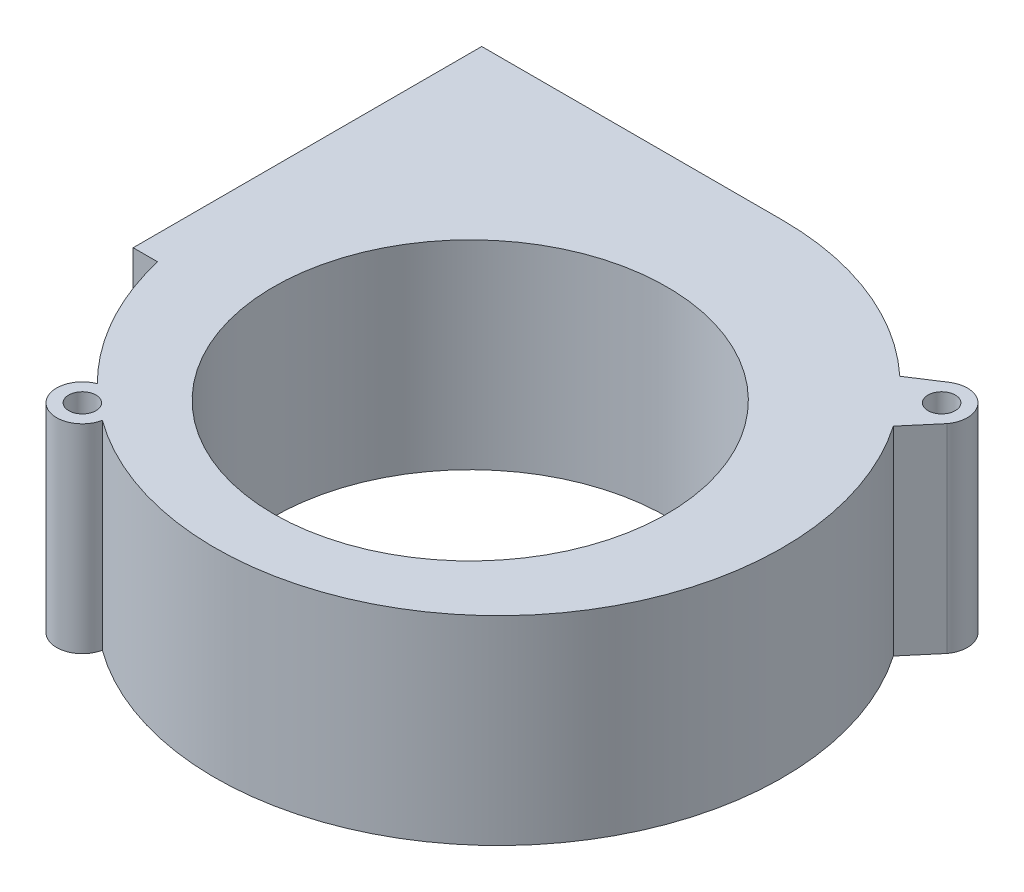
ISO-10303-21;
HEADER;
FILE_DESCRIPTION(('STEP AP214'),'2;1');
FILE_NAME('part.step','',(''),(''),'','','');
FILE_SCHEMA(('AUTOMOTIVE_DESIGN { 1 0 10303 214 1 1 1 1 }'));
ENDSEC;
DATA;
#1=APPLICATION_CONTEXT('core data for automotive mechanical design processes');
#2=APPLICATION_PROTOCOL_DEFINITION('international standard','automotive_design',2000,#1);
#3=PRODUCT_CONTEXT('',#1,'mechanical');
#4=PRODUCT('Part','Part','',(#3));
#5=PRODUCT_RELATED_PRODUCT_CATEGORY('part','',(#4));
#6=PRODUCT_DEFINITION_FORMATION('','',#4);
#7=PRODUCT_DEFINITION_CONTEXT('part definition',#1,'design');
#8=PRODUCT_DEFINITION('design','',#6,#7);
#9=PRODUCT_DEFINITION_SHAPE('','',#8);
#10=(LENGTH_UNIT() NAMED_UNIT(*) SI_UNIT(.MILLI.,.METRE.));
#11=(NAMED_UNIT(*) PLANE_ANGLE_UNIT() SI_UNIT($,.RADIAN.));
#12=(NAMED_UNIT(*) SI_UNIT($,.STERADIAN.) SOLID_ANGLE_UNIT());
#13=UNCERTAINTY_MEASURE_WITH_UNIT(LENGTH_MEASURE(1.E-05),#10,'distance_accuracy_value','');
#14=(GEOMETRIC_REPRESENTATION_CONTEXT(3) GLOBAL_UNCERTAINTY_ASSIGNED_CONTEXT((#13)) GLOBAL_UNIT_ASSIGNED_CONTEXT((#10,
#11,#12)) REPRESENTATION_CONTEXT('',''));
#15=CARTESIAN_POINT('',(0.,0.,0.));
#16=DIRECTION('',(0.,0.,1.));
#17=DIRECTION('',(1.,0.,0.));
#18=AXIS2_PLACEMENT_3D('',#15,#16,#17);
#19=CARTESIAN_POINT('',(0.,32.9,0.));
#20=DIRECTION('',(0.,1.,0.));
#21=DIRECTION('',(0.,0.,1.));
#22=AXIS2_PLACEMENT_3D('',#19,#20,#21);
#23=PLANE('',#22);
#24=CARTESIAN_POINT('',(-31.7,32.9,37.1));
#25=DIRECTION('',(0.,1.,0.));
#26=DIRECTION('',(0.,0.,1.));
#27=AXIS2_PLACEMENT_3D('',#24,#25,#26);
#28=CIRCLE('',#27,2.25);
#29=CARTESIAN_POINT('',(-31.7,32.9,39.35));
#30=VERTEX_POINT('',#29);
#31=EDGE_CURVE('E214',#30,#30,#28,.T.);
#32=ORIENTED_EDGE('',*,*,#31,.F.);
#33=EDGE_LOOP('',(#32));
#34=FACE_BOUND('',#33,.T.);
#35=DIRECTION('',(0.,0.,1.));
#36=VECTOR('',#35,1.);
#37=CARTESIAN_POINT('',(-49.7,32.9,-46.9));
#38=LINE('',#37,#36);
#39=CARTESIAN_POINT('',(-49.7,32.9,-46.9));
#40=VERTEX_POINT('',#39);
#41=CARTESIAN_POINT('',(-49.7,32.9,10.7));
#42=VERTEX_POINT('',#41);
#43=EDGE_CURVE('E163',#40,#42,#38,.T.);
#44=ORIENTED_EDGE('',*,*,#43,.T.);
#45=DIRECTION('',(1.,0.,0.));
#46=VECTOR('',#45,1.);
#47=CARTESIAN_POINT('',(-49.7,32.9,10.7));
#48=LINE('',#47,#46);
#49=CARTESIAN_POINT('',(-45.6631142170571,32.9,10.7));
#50=VERTEX_POINT('',#49);
#51=EDGE_CURVE('E101',#42,#50,#48,.T.);
#52=ORIENTED_EDGE('',*,*,#51,.T.);
#53=CARTESIAN_POINT('',(0.,32.9,0.));
#54=DIRECTION('',(0.,1.,0.));
#55=DIRECTION('',(0.,0.,1.));
#56=AXIS2_PLACEMENT_3D('',#53,#54,#55);
#57=CIRCLE('',#56,46.9);
#58=CARTESIAN_POINT('',(-33.2022241047671,32.9,33.1243462501047));
#59=VERTEX_POINT('',#58);
#60=EDGE_CURVE('E184',#50,#59,#57,.T.);
#61=ORIENTED_EDGE('',*,*,#60,.T.);
#62=CARTESIAN_POINT('',(-31.7,32.9,37.1));
#63=DIRECTION('',(0.,1.,0.));
#64=DIRECTION('',(0.,0.,1.));
#65=AXIS2_PLACEMENT_3D('',#62,#63,#64);
#66=CIRCLE('',#65,4.25000000000003);
#67=CARTESIAN_POINT('',(-27.5386593412498,32.9,37.9635646599025));
#68=VERTEX_POINT('',#67);
#69=EDGE_CURVE('E203',#59,#68,#66,.T.);
#70=ORIENTED_EDGE('',*,*,#69,.T.);
#71=CARTESIAN_POINT('',(0.,32.9,0.));
#72=DIRECTION('',(0.,1.,0.));
#73=DIRECTION('',(0.,0.,1.));
#74=AXIS2_PLACEMENT_3D('',#71,#72,#73);
#75=CIRCLE('',#74,46.9);
#76=CARTESIAN_POINT('',(38.6455597513089,32.9,-26.5731200935835));
#77=VERTEX_POINT('',#76);
#78=EDGE_CURVE('E200',#68,#77,#75,.T.);
#79=ORIENTED_EDGE('',*,*,#78,.T.);
#80=DIRECTION('',(0.646894195548535,0.,-0.762579766165884));
#81=VECTOR('',#80,1.);
#82=CARTESIAN_POINT('',(38.6455597513089,32.9,-26.5731200935835));
#83=LINE('',#82,#81);
#84=CARTESIAN_POINT('',(42.7160728694985,32.9,-31.3715723956822));
#85=VERTEX_POINT('',#84);
#86=EDGE_CURVE('E202',#77,#85,#83,.T.);
#87=ORIENTED_EDGE('',*,*,#86,.T.);
#88=CARTESIAN_POINT('',(39.3,32.9,-33.9));
#89=DIRECTION('',(0.,1.,0.));
#90=DIRECTION('',(0.,0.,1.));
#91=AXIS2_PLACEMENT_3D('',#88,#89,#90);
#92=CIRCLE('',#91,4.25000000000001);
#93=CARTESIAN_POINT('',(36.9851611538318,32.9,-37.4642700678078));
#94=VERTEX_POINT('',#93);
#95=EDGE_CURVE('E126',#85,#94,#92,.T.);
#96=ORIENTED_EDGE('',*,*,#95,.T.);
#97=DIRECTION('',(-0.838651780660658,0.,0.544667963804287));
#98=VECTOR('',#97,1.);
#99=CARTESIAN_POINT('',(32.03822815075,32.9,-34.2514516036984));
#100=LINE('',#99,#98);
#101=CARTESIAN_POINT('',(32.03822815075,32.9,-34.2514516036984));
#102=VERTEX_POINT('',#101);
#103=EDGE_CURVE('E120',#94,#102,#100,.T.);
#104=ORIENTED_EDGE('',*,*,#103,.T.);
#105=CARTESIAN_POINT('',(0.,32.9,0.));
#106=DIRECTION('',(0.,1.,0.));
#107=DIRECTION('',(0.,0.,1.));
#108=AXIS2_PLACEMENT_3D('',#105,#106,#107);
#109=CIRCLE('',#108,46.9);
#110=CARTESIAN_POINT('',(0.,32.9,-46.9));
#111=VERTEX_POINT('',#110);
#112=EDGE_CURVE('E124',#102,#111,#109,.T.);
#113=ORIENTED_EDGE('',*,*,#112,.T.);
#114=DIRECTION('',(-1.,0.,0.));
#115=VECTOR('',#114,1.);
#116=CARTESIAN_POINT('',(-49.7,32.9,-46.9));
#117=LINE('',#116,#115);
#118=EDGE_CURVE('E52',#111,#40,#117,.T.);
#119=ORIENTED_EDGE('',*,*,#118,.T.);
#120=EDGE_LOOP('',(#44,#52,#61,#70,#79,#87,#96,#104,#113,#119));
#121=FACE_BOUND('',#120,.T.);
#122=CARTESIAN_POINT('',(0.,32.9,4.7));
#123=DIRECTION('',(0.,1.,0.));
#124=DIRECTION('',(0.,0.,1.));
#125=AXIS2_PLACEMENT_3D('',#122,#123,#124);
#126=CIRCLE('',#125,32.5);
#127=CARTESIAN_POINT('',(0.,32.9,37.2));
#128=VERTEX_POINT('',#127);
#129=EDGE_CURVE('E148',#128,#128,#126,.T.);
#130=ORIENTED_EDGE('',*,*,#129,.F.);
#131=EDGE_LOOP('',(#130));
#132=FACE_BOUND('',#131,.T.);
#133=CARTESIAN_POINT('',(39.3,32.9,-33.9));
#134=DIRECTION('',(0.,1.,0.));
#135=DIRECTION('',(0.,0.,1.));
#136=AXIS2_PLACEMENT_3D('',#133,#134,#135);
#137=CIRCLE('',#136,2.25);
#138=CARTESIAN_POINT('',(39.3,32.9,-31.65));
#139=VERTEX_POINT('',#138);
#140=EDGE_CURVE('E220',#139,#139,#137,.T.);
#141=ORIENTED_EDGE('',*,*,#140,.F.);
#142=EDGE_LOOP('',(#141));
#143=FACE_BOUND('',#142,.T.);
#144=ADVANCED_FACE('F35',(#34,#121,#132,#143),#23,.T.);
#145=CARTESIAN_POINT('',(0.,0.,0.));
#146=DIRECTION('',(0.,1.,0.));
#147=DIRECTION('',(0.,0.,1.));
#148=AXIS2_PLACEMENT_3D('',#145,#146,#147);
#149=PLANE('',#148);
#150=DIRECTION('',(0.,0.,1.));
#151=VECTOR('',#150,1.);
#152=CARTESIAN_POINT('',(-49.7,0.,-46.9));
#153=LINE('',#152,#151);
#154=CARTESIAN_POINT('',(-49.7,0.,-46.9));
#155=VERTEX_POINT('',#154);
#156=CARTESIAN_POINT('',(-49.7,0.,10.7));
#157=VERTEX_POINT('',#156);
#158=EDGE_CURVE('E144',#155,#157,#153,.T.);
#159=ORIENTED_EDGE('',*,*,#158,.F.);
#160=DIRECTION('',(-1.,0.,0.));
#161=VECTOR('',#160,1.);
#162=CARTESIAN_POINT('',(-49.7,0.,-46.9));
#163=LINE('',#162,#161);
#164=CARTESIAN_POINT('',(0.,0.,-46.9));
#165=VERTEX_POINT('',#164);
#166=EDGE_CURVE('E93',#165,#155,#163,.T.);
#167=ORIENTED_EDGE('',*,*,#166,.F.);
#168=CARTESIAN_POINT('',(0.,0.,0.));
#169=DIRECTION('',(0.,1.,0.));
#170=DIRECTION('',(0.,0.,1.));
#171=AXIS2_PLACEMENT_3D('',#168,#169,#170);
#172=CIRCLE('',#171,46.9);
#173=CARTESIAN_POINT('',(32.03822815075,0.,-34.2514516036984));
#174=VERTEX_POINT('',#173);
#175=EDGE_CURVE('E87',#174,#165,#172,.T.);
#176=ORIENTED_EDGE('',*,*,#175,.F.);
#177=DIRECTION('',(-0.838651780660658,0.,0.544667963804287));
#178=VECTOR('',#177,1.);
#179=CARTESIAN_POINT('',(32.03822815075,0.,-34.2514516036984));
#180=LINE('',#179,#178);
#181=CARTESIAN_POINT('',(36.9851611538318,0.,-37.4642700678078));
#182=VERTEX_POINT('',#181);
#183=EDGE_CURVE('E134',#182,#174,#180,.T.);
#184=ORIENTED_EDGE('',*,*,#183,.F.);
#185=CARTESIAN_POINT('',(39.3,0.,-33.9));
#186=DIRECTION('',(0.,1.,0.));
#187=DIRECTION('',(0.,0.,1.));
#188=AXIS2_PLACEMENT_3D('',#185,#186,#187);
#189=CIRCLE('',#188,4.25000000000001);
#190=CARTESIAN_POINT('',(42.7160728694985,0.,-31.3715723956822));
#191=VERTEX_POINT('',#190);
#192=EDGE_CURVE('E158',#191,#182,#189,.T.);
#193=ORIENTED_EDGE('',*,*,#192,.F.);
#194=DIRECTION('',(0.646894195548535,0.,-0.762579766165884));
#195=VECTOR('',#194,1.);
#196=CARTESIAN_POINT('',(38.6455597513089,0.,-26.5731200935835));
#197=LINE('',#196,#195);
#198=CARTESIAN_POINT('',(38.6455597513089,0.,-26.5731200935835));
#199=VERTEX_POINT('',#198);
#200=EDGE_CURVE('E156',#199,#191,#197,.T.);
#201=ORIENTED_EDGE('',*,*,#200,.F.);
#202=CARTESIAN_POINT('',(0.,0.,0.));
#203=DIRECTION('',(0.,1.,0.));
#204=DIRECTION('',(0.,0.,1.));
#205=AXIS2_PLACEMENT_3D('',#202,#203,#204);
#206=CIRCLE('',#205,46.9);
#207=CARTESIAN_POINT('',(-27.5386593412498,0.,37.9635646599025));
#208=VERTEX_POINT('',#207);
#209=EDGE_CURVE('E154',#208,#199,#206,.T.);
#210=ORIENTED_EDGE('',*,*,#209,.F.);
#211=CARTESIAN_POINT('',(-31.7,0.,37.1));
#212=DIRECTION('',(0.,1.,0.));
#213=DIRECTION('',(0.,0.,1.));
#214=AXIS2_PLACEMENT_3D('',#211,#212,#213);
#215=CIRCLE('',#214,4.25000000000003);
#216=CARTESIAN_POINT('',(-33.2022241047671,0.,33.1243462501047));
#217=VERTEX_POINT('',#216);
#218=EDGE_CURVE('E152',#217,#208,#215,.T.);
#219=ORIENTED_EDGE('',*,*,#218,.F.);
#220=CARTESIAN_POINT('',(0.,0.,0.));
#221=DIRECTION('',(0.,1.,0.));
#222=DIRECTION('',(0.,0.,1.));
#223=AXIS2_PLACEMENT_3D('',#220,#221,#222);
#224=CIRCLE('',#223,46.9);
#225=CARTESIAN_POINT('',(-45.6631142170571,0.,10.7));
#226=VERTEX_POINT('',#225);
#227=EDGE_CURVE('E150',#226,#217,#224,.T.);
#228=ORIENTED_EDGE('',*,*,#227,.F.);
#229=DIRECTION('',(1.,0.,0.));
#230=VECTOR('',#229,1.);
#231=CARTESIAN_POINT('',(-49.7,0.,10.7));
#232=LINE('',#231,#230);
#233=EDGE_CURVE('E147',#157,#226,#232,.T.);
#234=ORIENTED_EDGE('',*,*,#233,.F.);
#235=EDGE_LOOP('',(#159,#167,#176,#184,#193,#201,#210,#219,#228,#234));
#236=FACE_BOUND('',#235,.T.);
#237=CARTESIAN_POINT('',(0.,0.,4.7));
#238=DIRECTION('',(0.,1.,0.));
#239=DIRECTION('',(0.,0.,1.));
#240=AXIS2_PLACEMENT_3D('',#237,#238,#239);
#241=CIRCLE('',#240,32.5);
#242=CARTESIAN_POINT('',(0.,0.,37.2));
#243=VERTEX_POINT('',#242);
#244=EDGE_CURVE('E211',#243,#243,#241,.T.);
#245=ORIENTED_EDGE('',*,*,#244,.T.);
#246=EDGE_LOOP('',(#245));
#247=FACE_BOUND('',#246,.T.);
#248=CARTESIAN_POINT('',(-31.7,0.,37.1));
#249=DIRECTION('',(0.,1.,0.));
#250=DIRECTION('',(0.,0.,1.));
#251=AXIS2_PLACEMENT_3D('',#248,#249,#250);
#252=CIRCLE('',#251,2.25);
#253=CARTESIAN_POINT('',(-31.7,0.,39.35));
#254=VERTEX_POINT('',#253);
#255=EDGE_CURVE('E217',#254,#254,#252,.T.);
#256=ORIENTED_EDGE('',*,*,#255,.T.);
#257=EDGE_LOOP('',(#256));
#258=FACE_BOUND('',#257,.T.);
#259=CARTESIAN_POINT('',(39.3,0.,-33.9));
#260=DIRECTION('',(0.,1.,0.));
#261=DIRECTION('',(0.,0.,1.));
#262=AXIS2_PLACEMENT_3D('',#259,#260,#261);
#263=CIRCLE('',#262,2.25);
#264=CARTESIAN_POINT('',(39.3,0.,-31.65));
#265=VERTEX_POINT('',#264);
#266=EDGE_CURVE('E223',#265,#265,#263,.T.);
#267=ORIENTED_EDGE('',*,*,#266,.T.);
#268=EDGE_LOOP('',(#267));
#269=FACE_BOUND('',#268,.T.);
#270=ADVANCED_FACE('F188',(#236,#247,#258,#269),#149,.F.);
#271=CARTESIAN_POINT('',(-49.7,32.9,-46.9));
#272=DIRECTION('',(1.,0.,0.));
#273=DIRECTION('',(0.,0.,-1.));
#274=AXIS2_PLACEMENT_3D('',#271,#272,#273);
#275=PLANE('',#274);
#276=ORIENTED_EDGE('',*,*,#158,.T.);
#277=DIRECTION('',(0.,-1.,0.));
#278=VECTOR('',#277,1.);
#279=CARTESIAN_POINT('',(-49.7,32.9,10.7));
#280=LINE('',#279,#278);
#281=EDGE_CURVE('E11',#42,#157,#280,.T.);
#282=ORIENTED_EDGE('',*,*,#281,.F.);
#283=ORIENTED_EDGE('',*,*,#43,.F.);
#284=DIRECTION('',(0.,-1.,0.));
#285=VECTOR('',#284,1.);
#286=CARTESIAN_POINT('',(-49.7,32.9,-46.9));
#287=LINE('',#286,#285);
#288=EDGE_CURVE('E140',#40,#155,#287,.T.);
#289=ORIENTED_EDGE('',*,*,#288,.T.);
#290=EDGE_LOOP('',(#276,#282,#283,#289));
#291=FACE_BOUND('',#290,.T.);
#292=ADVANCED_FACE('F37',(#291),#275,.F.);
#293=CARTESIAN_POINT('',(-49.7,32.9,10.7));
#294=DIRECTION('',(0.,0.,-1.));
#295=DIRECTION('',(-1.,0.,0.));
#296=AXIS2_PLACEMENT_3D('',#293,#294,#295);
#297=PLANE('',#296);
#298=ORIENTED_EDGE('',*,*,#233,.T.);
#299=DIRECTION('',(0.,-1.,0.));
#300=VECTOR('',#299,1.);
#301=CARTESIAN_POINT('',(-45.6631142170571,32.9,10.7));
#302=LINE('',#301,#300);
#303=EDGE_CURVE('E44',#50,#226,#302,.T.);
#304=ORIENTED_EDGE('',*,*,#303,.F.);
#305=ORIENTED_EDGE('',*,*,#51,.F.);
#306=ORIENTED_EDGE('',*,*,#281,.T.);
#307=EDGE_LOOP('',(#298,#304,#305,#306));
#308=FACE_BOUND('',#307,.T.);
#309=ADVANCED_FACE('F264',(#308),#297,.F.);
#310=CARTESIAN_POINT('',(0.,32.9,0.));
#311=DIRECTION('',(0.,-1.,0.));
#312=DIRECTION('',(0.,0.,-1.));
#313=AXIS2_PLACEMENT_3D('',#310,#311,#312);
#314=CYLINDRICAL_SURFACE('',#313,46.9);
#315=ORIENTED_EDGE('',*,*,#227,.T.);
#316=DIRECTION('',(0.,-1.,0.));
#317=VECTOR('',#316,1.);
#318=CARTESIAN_POINT('',(-33.2022241047671,32.9,33.1243462501047));
#319=LINE('',#318,#317);
#320=EDGE_CURVE('E176',#59,#217,#319,.T.);
#321=ORIENTED_EDGE('',*,*,#320,.F.);
#322=ORIENTED_EDGE('',*,*,#60,.F.);
#323=ORIENTED_EDGE('',*,*,#303,.T.);
#324=EDGE_LOOP('',(#315,#321,#322,#323));
#325=FACE_BOUND('',#324,.T.);
#326=ADVANCED_FACE('F182',(#325),#314,.T.);
#327=CARTESIAN_POINT('',(-31.7,32.9,37.1));
#328=DIRECTION('',(0.,-1.,0.));
#329=DIRECTION('',(0.,0.,-1.));
#330=AXIS2_PLACEMENT_3D('',#327,#328,#329);
#331=CYLINDRICAL_SURFACE('',#330,4.25000000000003);
#332=ORIENTED_EDGE('',*,*,#218,.T.);
#333=DIRECTION('',(0.,-1.,0.));
#334=VECTOR('',#333,1.);
#335=CARTESIAN_POINT('',(-27.5386593412498,32.9,37.9635646599025));
#336=LINE('',#335,#334);
#337=EDGE_CURVE('E173',#68,#208,#336,.T.);
#338=ORIENTED_EDGE('',*,*,#337,.F.);
#339=ORIENTED_EDGE('',*,*,#69,.F.);
#340=ORIENTED_EDGE('',*,*,#320,.T.);
#341=EDGE_LOOP('',(#332,#338,#339,#340));
#342=FACE_BOUND('',#341,.T.);
#343=ADVANCED_FACE('F194',(#342),#331,.T.);
#344=CARTESIAN_POINT('',(0.,32.9,0.));
#345=DIRECTION('',(0.,-1.,0.));
#346=DIRECTION('',(0.,0.,-1.));
#347=AXIS2_PLACEMENT_3D('',#344,#345,#346);
#348=CYLINDRICAL_SURFACE('',#347,46.9);
#349=ORIENTED_EDGE('',*,*,#209,.T.);
#350=DIRECTION('',(0.,-1.,0.));
#351=VECTOR('',#350,1.);
#352=CARTESIAN_POINT('',(38.6455597513089,32.9,-26.5731200935835));
#353=LINE('',#352,#351);
#354=EDGE_CURVE('E170',#77,#199,#353,.T.);
#355=ORIENTED_EDGE('',*,*,#354,.F.);
#356=ORIENTED_EDGE('',*,*,#78,.F.);
#357=ORIENTED_EDGE('',*,*,#337,.T.);
#358=EDGE_LOOP('',(#349,#355,#356,#357));
#359=FACE_BOUND('',#358,.T.);
#360=ADVANCED_FACE('F198',(#359),#348,.T.);
#361=CARTESIAN_POINT('',(38.6455597513089,32.9,-26.5731200935835));
#362=DIRECTION('',(-0.762579766165884,0.,-0.646894195548535));
#363=DIRECTION('',(-0.646894195548535,0.,0.762579766165884));
#364=AXIS2_PLACEMENT_3D('',#361,#362,#363);
#365=PLANE('',#364);
#366=ORIENTED_EDGE('',*,*,#200,.T.);
#367=DIRECTION('',(0.,-1.,0.));
#368=VECTOR('',#367,1.);
#369=CARTESIAN_POINT('',(42.7160728694985,32.9,-31.3715723956822));
#370=LINE('',#369,#368);
#371=EDGE_CURVE('E167',#85,#191,#370,.T.);
#372=ORIENTED_EDGE('',*,*,#371,.F.);
#373=ORIENTED_EDGE('',*,*,#86,.F.);
#374=ORIENTED_EDGE('',*,*,#354,.T.);
#375=EDGE_LOOP('',(#366,#372,#373,#374));
#376=FACE_BOUND('',#375,.T.);
#377=ADVANCED_FACE('F254',(#376),#365,.F.);
#378=CARTESIAN_POINT('',(39.3,32.9,-33.9));
#379=DIRECTION('',(0.,-1.,0.));
#380=DIRECTION('',(0.,0.,-1.));
#381=AXIS2_PLACEMENT_3D('',#378,#379,#380);
#382=CYLINDRICAL_SURFACE('',#381,4.25000000000001);
#383=ORIENTED_EDGE('',*,*,#192,.T.);
#384=DIRECTION('',(0.,-1.,0.));
#385=VECTOR('',#384,1.);
#386=CARTESIAN_POINT('',(36.9851611538318,32.9,-37.4642700678078));
#387=LINE('',#386,#385);
#388=EDGE_CURVE('E135',#94,#182,#387,.T.);
#389=ORIENTED_EDGE('',*,*,#388,.F.);
#390=ORIENTED_EDGE('',*,*,#95,.F.);
#391=ORIENTED_EDGE('',*,*,#371,.T.);
#392=EDGE_LOOP('',(#383,#389,#390,#391));
#393=FACE_BOUND('',#392,.T.);
#394=ADVANCED_FACE('F251',(#393),#382,.T.);
#395=CARTESIAN_POINT('',(32.03822815075,32.9,-34.2514516036984));
#396=DIRECTION('',(0.544667963804287,0.,0.838651780660658));
#397=DIRECTION('',(0.838651780660658,0.,-0.544667963804287));
#398=AXIS2_PLACEMENT_3D('',#395,#396,#397);
#399=PLANE('',#398);
#400=ORIENTED_EDGE('',*,*,#183,.T.);
#401=DIRECTION('',(0.,-1.,0.));
#402=VECTOR('',#401,1.);
#403=CARTESIAN_POINT('',(32.03822815075,32.9,-34.2514516036984));
#404=LINE('',#403,#402);
#405=EDGE_CURVE('E131',#102,#174,#404,.T.);
#406=ORIENTED_EDGE('',*,*,#405,.F.);
#407=ORIENTED_EDGE('',*,*,#103,.F.);
#408=ORIENTED_EDGE('',*,*,#388,.T.);
#409=EDGE_LOOP('',(#400,#406,#407,#408));
#410=FACE_BOUND('',#409,.T.);
#411=ADVANCED_FACE('F132',(#410),#399,.F.);
#412=CARTESIAN_POINT('',(0.,32.9,0.));
#413=DIRECTION('',(0.,-1.,0.));
#414=DIRECTION('',(0.,0.,-1.));
#415=AXIS2_PLACEMENT_3D('',#412,#413,#414);
#416=CYLINDRICAL_SURFACE('',#415,46.9);
#417=ORIENTED_EDGE('',*,*,#175,.T.);
#418=DIRECTION('',(0.,-1.,0.));
#419=VECTOR('',#418,1.);
#420=CARTESIAN_POINT('',(0.,32.9,-46.9));
#421=LINE('',#420,#419);
#422=EDGE_CURVE('E136',#111,#165,#421,.T.);
#423=ORIENTED_EDGE('',*,*,#422,.F.);
#424=ORIENTED_EDGE('',*,*,#112,.F.);
#425=ORIENTED_EDGE('',*,*,#405,.T.);
#426=EDGE_LOOP('',(#417,#423,#424,#425));
#427=FACE_BOUND('',#426,.T.);
#428=ADVANCED_FACE('F138',(#427),#416,.T.);
#429=CARTESIAN_POINT('',(-49.7,32.9,-46.9));
#430=DIRECTION('',(0.,0.,1.));
#431=DIRECTION('',(1.,0.,0.));
#432=AXIS2_PLACEMENT_3D('',#429,#430,#431);
#433=PLANE('',#432);
#434=ORIENTED_EDGE('',*,*,#166,.T.);
#435=ORIENTED_EDGE('',*,*,#288,.F.);
#436=ORIENTED_EDGE('',*,*,#118,.F.);
#437=ORIENTED_EDGE('',*,*,#422,.T.);
#438=EDGE_LOOP('',(#434,#435,#436,#437));
#439=FACE_BOUND('',#438,.T.);
#440=ADVANCED_FACE('F244',(#439),#433,.F.);
#441=CARTESIAN_POINT('',(0.,32.9,4.7));
#442=DIRECTION('',(0.,-1.,0.));
#443=DIRECTION('',(0.,0.,-1.));
#444=AXIS2_PLACEMENT_3D('',#441,#442,#443);
#445=CYLINDRICAL_SURFACE('',#444,32.5);
#446=ORIENTED_EDGE('',*,*,#129,.T.);
#447=EDGE_LOOP('',(#446));
#448=FACE_BOUND('',#447,.T.);
#449=ORIENTED_EDGE('',*,*,#244,.F.);
#450=EDGE_LOOP('',(#449));
#451=FACE_BOUND('',#450,.T.);
#452=ADVANCED_FACE('F241',(#448,#451),#445,.F.);
#453=CARTESIAN_POINT('',(-31.7,32.9,37.1));
#454=DIRECTION('',(0.,-1.,0.));
#455=DIRECTION('',(0.,0.,-1.));
#456=AXIS2_PLACEMENT_3D('',#453,#454,#455);
#457=CYLINDRICAL_SURFACE('',#456,2.25);
#458=ORIENTED_EDGE('',*,*,#31,.T.);
#459=EDGE_LOOP('',(#458));
#460=FACE_BOUND('',#459,.T.);
#461=ORIENTED_EDGE('',*,*,#255,.F.);
#462=EDGE_LOOP('',(#461));
#463=FACE_BOUND('',#462,.T.);
#464=ADVANCED_FACE('F340',(#460,#463),#457,.F.);
#465=CARTESIAN_POINT('',(39.3,32.9,-33.9));
#466=DIRECTION('',(0.,-1.,0.));
#467=DIRECTION('',(0.,0.,-1.));
#468=AXIS2_PLACEMENT_3D('',#465,#466,#467);
#469=CYLINDRICAL_SURFACE('',#468,2.25);
#470=ORIENTED_EDGE('',*,*,#140,.T.);
#471=EDGE_LOOP('',(#470));
#472=FACE_BOUND('',#471,.T.);
#473=ORIENTED_EDGE('',*,*,#266,.F.);
#474=EDGE_LOOP('',(#473));
#475=FACE_BOUND('',#474,.T.);
#476=ADVANCED_FACE('F229',(#472,#475),#469,.F.);
#477=CLOSED_SHELL('',(#144,#270,#292,#309,#326,#343,#360,#377,#394,#411,#428,#440,#452,#464,#476));
#478=MANIFOLD_SOLID_BREP('B2',#477);
#479=ADVANCED_BREP_SHAPE_REPRESENTATION('',(#18,#478),#14);
#480=SHAPE_DEFINITION_REPRESENTATION(#9,#479);
ENDSEC;
END-ISO-10303-21;
